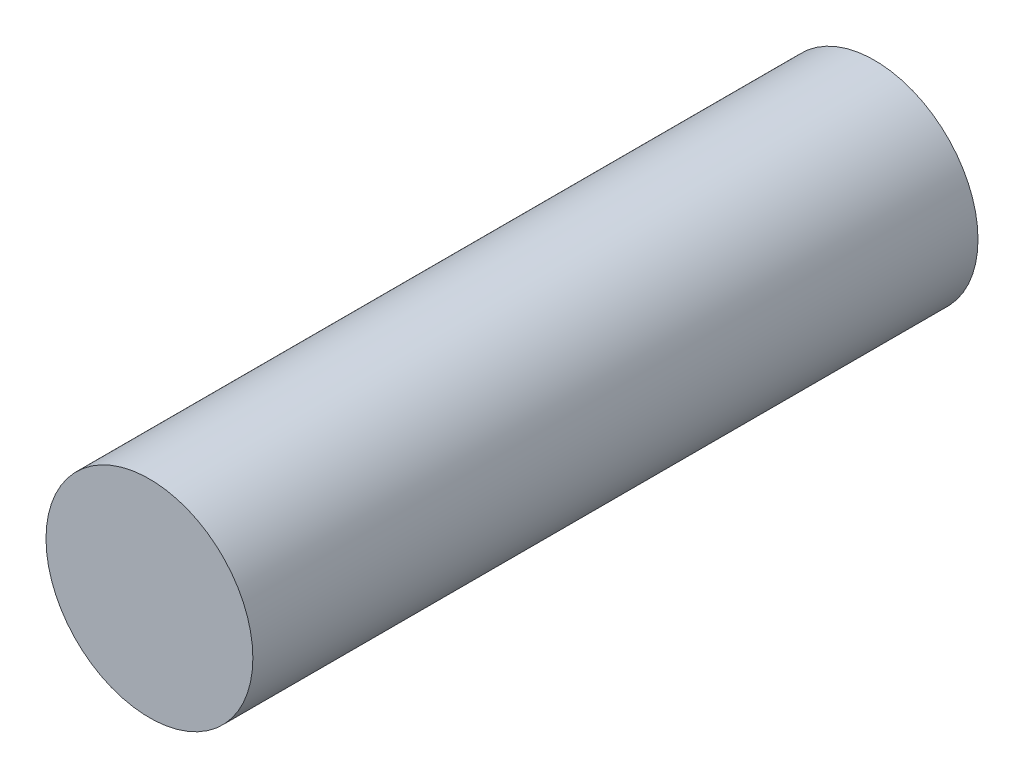
ISO-10303-21;
HEADER;
FILE_DESCRIPTION(('STEP AP214'),'2;1');
FILE_NAME('part.step','',(''),(''),'','','');
FILE_SCHEMA(('AUTOMOTIVE_DESIGN { 1 0 10303 214 1 1 1 1 }'));
ENDSEC;
DATA;
#1=APPLICATION_CONTEXT('core data for automotive mechanical design processes');
#2=APPLICATION_PROTOCOL_DEFINITION('international standard','automotive_design',2000,#1);
#3=PRODUCT_CONTEXT('',#1,'mechanical');
#4=PRODUCT('Part','Part','',(#3));
#5=PRODUCT_RELATED_PRODUCT_CATEGORY('part','',(#4));
#6=PRODUCT_DEFINITION_FORMATION('','',#4);
#7=PRODUCT_DEFINITION_CONTEXT('part definition',#1,'design');
#8=PRODUCT_DEFINITION('design','',#6,#7);
#9=PRODUCT_DEFINITION_SHAPE('','',#8);
#10=(LENGTH_UNIT() NAMED_UNIT(*) SI_UNIT(.MILLI.,.METRE.));
#11=(NAMED_UNIT(*) PLANE_ANGLE_UNIT() SI_UNIT($,.RADIAN.));
#12=(NAMED_UNIT(*) SI_UNIT($,.STERADIAN.) SOLID_ANGLE_UNIT());
#13=UNCERTAINTY_MEASURE_WITH_UNIT(LENGTH_MEASURE(1.E-05),#10,'distance_accuracy_value','');
#14=(GEOMETRIC_REPRESENTATION_CONTEXT(3) GLOBAL_UNCERTAINTY_ASSIGNED_CONTEXT((#13)) GLOBAL_UNIT_ASSIGNED_CONTEXT((#10,
#11,#12)) REPRESENTATION_CONTEXT('',''));
#15=CARTESIAN_POINT('',(0.,0.,0.));
#16=DIRECTION('',(0.,0.,1.));
#17=DIRECTION('',(1.,0.,0.));
#18=AXIS2_PLACEMENT_3D('',#15,#16,#17);
#19=CARTESIAN_POINT('',(0.,0.,32.6));
#20=DIRECTION('',(0.,0.,-1.));
#21=DIRECTION('',(-1.,0.,0.));
#22=AXIS2_PLACEMENT_3D('',#19,#20,#21);
#23=CYLINDRICAL_SURFACE('',#22,9.3);
#24=CARTESIAN_POINT('',(0.,0.,32.6));
#25=DIRECTION('',(0.,0.,1.));
#26=DIRECTION('',(1.,0.,0.));
#27=AXIS2_PLACEMENT_3D('',#24,#25,#26);
#28=CIRCLE('',#27,9.3);
#29=CARTESIAN_POINT('',(9.3,0.,32.6));
#30=VERTEX_POINT('',#29);
#31=EDGE_CURVE('E10',#30,#30,#28,.T.);
#32=ORIENTED_EDGE('',*,*,#31,.F.);
#33=EDGE_LOOP('',(#32));
#34=FACE_BOUND('',#33,.T.);
#35=CARTESIAN_POINT('',(0.,0.,-32.6));
#36=DIRECTION('',(0.,0.,1.));
#37=DIRECTION('',(1.,0.,0.));
#38=AXIS2_PLACEMENT_3D('',#35,#36,#37);
#39=CIRCLE('',#38,9.3);
#40=CARTESIAN_POINT('',(9.3,0.,-32.6));
#41=VERTEX_POINT('',#40);
#42=EDGE_CURVE('E40',#41,#41,#39,.T.);
#43=ORIENTED_EDGE('',*,*,#42,.T.);
#44=EDGE_LOOP('',(#43));
#45=FACE_BOUND('',#44,.T.);
#46=ADVANCED_FACE('F37',(#34,#45),#23,.T.);
#47=CARTESIAN_POINT('',(0.,0.,32.6));
#48=DIRECTION('',(0.,0.,1.));
#49=DIRECTION('',(1.,0.,0.));
#50=AXIS2_PLACEMENT_3D('',#47,#48,#49);
#51=PLANE('',#50);
#52=ORIENTED_EDGE('',*,*,#31,.T.);
#53=EDGE_LOOP('',(#52));
#54=FACE_BOUND('',#53,.T.);
#55=ADVANCED_FACE('F54',(#54),#51,.T.);
#56=CARTESIAN_POINT('',(0.,0.,-32.6));
#57=DIRECTION('',(0.,0.,1.));
#58=DIRECTION('',(1.,0.,0.));
#59=AXIS2_PLACEMENT_3D('',#56,#57,#58);
#60=PLANE('',#59);
#61=ORIENTED_EDGE('',*,*,#42,.F.);
#62=EDGE_LOOP('',(#61));
#63=FACE_BOUND('',#62,.T.);
#64=ADVANCED_FACE('F52',(#63),#60,.F.);
#65=CLOSED_SHELL('',(#46,#55,#64));
#66=MANIFOLD_SOLID_BREP('B2',#65);
#67=ADVANCED_BREP_SHAPE_REPRESENTATION('',(#18,#66),#14);
#68=SHAPE_DEFINITION_REPRESENTATION(#9,#67);
ENDSEC;
END-ISO-10303-21;
